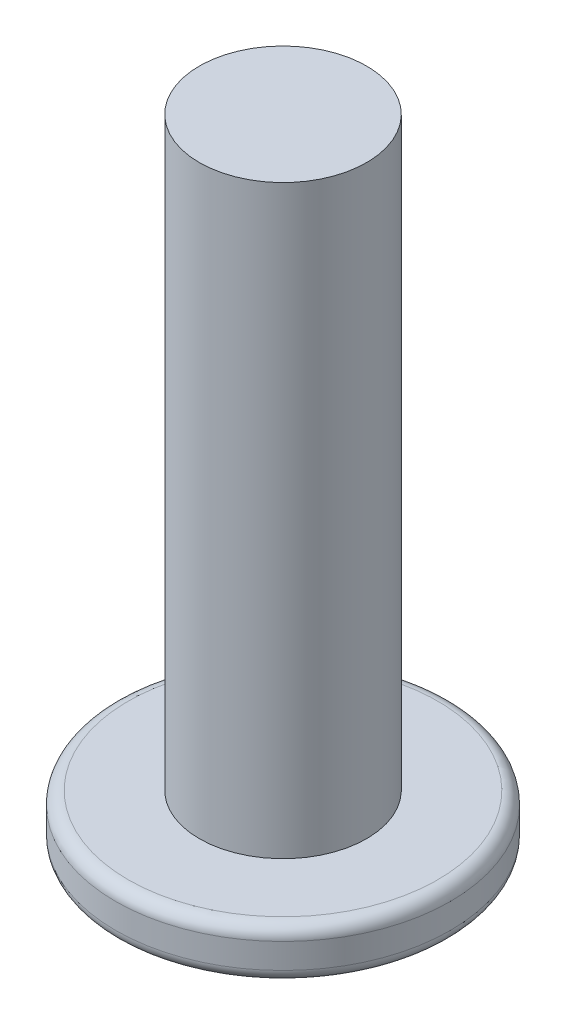
ISO-10303-21;
HEADER;
FILE_DESCRIPTION(('STEP AP214'),'2;1');
FILE_NAME('part.step','',(''),(''),'','','');
FILE_SCHEMA(('AUTOMOTIVE_DESIGN { 1 0 10303 214 1 1 1 1 }'));
ENDSEC;
DATA;
#1=APPLICATION_CONTEXT('core data for automotive mechanical design processes');
#2=APPLICATION_PROTOCOL_DEFINITION('international standard','automotive_design',2000,#1);
#3=PRODUCT_CONTEXT('',#1,'mechanical');
#4=PRODUCT('Part','Part','',(#3));
#5=PRODUCT_RELATED_PRODUCT_CATEGORY('part','',(#4));
#6=PRODUCT_DEFINITION_FORMATION('','',#4);
#7=PRODUCT_DEFINITION_CONTEXT('part definition',#1,'design');
#8=PRODUCT_DEFINITION('design','',#6,#7);
#9=PRODUCT_DEFINITION_SHAPE('','',#8);
#10=(LENGTH_UNIT() NAMED_UNIT(*) SI_UNIT(.MILLI.,.METRE.));
#11=(NAMED_UNIT(*) PLANE_ANGLE_UNIT() SI_UNIT($,.RADIAN.));
#12=(NAMED_UNIT(*) SI_UNIT($,.STERADIAN.) SOLID_ANGLE_UNIT());
#13=UNCERTAINTY_MEASURE_WITH_UNIT(LENGTH_MEASURE(1.E-05),#10,'distance_accuracy_value','');
#14=(GEOMETRIC_REPRESENTATION_CONTEXT(3) GLOBAL_UNCERTAINTY_ASSIGNED_CONTEXT((#13)) GLOBAL_UNIT_ASSIGNED_CONTEXT((#10,
#11,#12)) REPRESENTATION_CONTEXT('',''));
#15=CARTESIAN_POINT('',(0.,0.,0.));
#16=DIRECTION('',(0.,0.,1.));
#17=DIRECTION('',(1.,0.,0.));
#18=AXIS2_PLACEMENT_3D('',#15,#16,#17);
#19=CARTESIAN_POINT('',(0.,1.2,0.));
#20=DIRECTION('',(0.,-1.,0.));
#21=DIRECTION('',(0.,0.,-1.));
#22=AXIS2_PLACEMENT_3D('',#19,#20,#21);
#23=CYLINDRICAL_SURFACE('',#22,4.);
#24=CARTESIAN_POINT('',(0.,0.3,0.));
#25=DIRECTION('',(0.,1.,0.));
#26=DIRECTION('',(0.,0.,1.));
#27=AXIS2_PLACEMENT_3D('',#24,#25,#26);
#28=CIRCLE('',#27,4.);
#29=CARTESIAN_POINT('',(0.,0.3,4.));
#30=VERTEX_POINT('',#29);
#31=EDGE_CURVE('E149',#30,#30,#28,.T.);
#32=ORIENTED_EDGE('',*,*,#31,.T.);
#33=EDGE_LOOP('',(#32));
#34=FACE_BOUND('',#33,.T.);
#35=CARTESIAN_POINT('',(0.,0.9,0.));
#36=DIRECTION('',(0.,1.,0.));
#37=DIRECTION('',(0.,0.,1.));
#38=AXIS2_PLACEMENT_3D('',#35,#36,#37);
#39=CIRCLE('',#38,4.);
#40=CARTESIAN_POINT('',(0.,0.9,4.));
#41=VERTEX_POINT('',#40);
#42=EDGE_CURVE('E146',#41,#41,#39,.F.);
#43=ORIENTED_EDGE('',*,*,#42,.T.);
#44=EDGE_LOOP('',(#43));
#45=FACE_BOUND('',#44,.T.);
#46=ADVANCED_FACE('F33',(#34,#45),#23,.T.);
#47=CARTESIAN_POINT('',(0.,1.2,0.));
#48=DIRECTION('',(0.,1.,0.));
#49=DIRECTION('',(0.,0.,1.));
#50=AXIS2_PLACEMENT_3D('',#47,#48,#49);
#51=PLANE('',#50);
#52=CARTESIAN_POINT('',(0.,1.2,0.));
#53=DIRECTION('',(0.,1.,0.));
#54=DIRECTION('',(0.,0.,1.));
#55=AXIS2_PLACEMENT_3D('',#52,#53,#54);
#56=CIRCLE('',#55,3.7);
#57=CARTESIAN_POINT('',(0.,1.2,3.7));
#58=VERTEX_POINT('',#57);
#59=EDGE_CURVE('E11',#58,#58,#56,.T.);
#60=ORIENTED_EDGE('',*,*,#59,.T.);
#61=EDGE_LOOP('',(#60));
#62=FACE_BOUND('',#61,.T.);
#63=CARTESIAN_POINT('',(0.,1.2,0.));
#64=DIRECTION('',(0.,1.,0.));
#65=DIRECTION('',(0.,0.,1.));
#66=AXIS2_PLACEMENT_3D('',#63,#64,#65);
#67=CIRCLE('',#66,2.);
#68=CARTESIAN_POINT('',(0.,1.2,2.));
#69=VERTEX_POINT('',#68);
#70=EDGE_CURVE('E143',#69,#69,#67,.T.);
#71=ORIENTED_EDGE('',*,*,#70,.F.);
#72=EDGE_LOOP('',(#71));
#73=FACE_BOUND('',#72,.T.);
#74=ADVANCED_FACE('F164',(#62,#73),#51,.T.);
#75=CARTESIAN_POINT('',(0.,0.,0.));
#76=DIRECTION('',(0.,1.,0.));
#77=DIRECTION('',(0.,0.,1.));
#78=AXIS2_PLACEMENT_3D('',#75,#76,#77);
#79=PLANE('',#78);
#80=DIRECTION('',(-0.5,0.,0.866025403784438));
#81=VECTOR('',#80,1.);
#82=CARTESIAN_POINT('',(1.44337567297406,0.,0.));
#83=LINE('',#82,#81);
#84=CARTESIAN_POINT('',(1.44337567297406,0.,0.));
#85=VERTEX_POINT('',#84);
#86=CARTESIAN_POINT('',(0.721687836487032,0.,1.25));
#87=VERTEX_POINT('',#86);
#88=EDGE_CURVE('E122',#85,#87,#83,.T.);
#89=ORIENTED_EDGE('',*,*,#88,.F.);
#90=DIRECTION('',(0.5,0.,0.866025403784439));
#91=VECTOR('',#90,1.);
#92=CARTESIAN_POINT('',(0.721687836487032,0.,-1.25));
#93=LINE('',#92,#91);
#94=CARTESIAN_POINT('',(0.721687836487032,0.,-1.25));
#95=VERTEX_POINT('',#94);
#96=EDGE_CURVE('E48',#95,#85,#93,.T.);
#97=ORIENTED_EDGE('',*,*,#96,.F.);
#98=DIRECTION('',(1.,0.,0.));
#99=VECTOR('',#98,1.);
#100=CARTESIAN_POINT('',(-0.721687836487033,0.,-1.25));
#101=LINE('',#100,#99);
#102=CARTESIAN_POINT('',(-0.721687836487033,0.,-1.25));
#103=VERTEX_POINT('',#102);
#104=EDGE_CURVE('E131',#103,#95,#101,.T.);
#105=ORIENTED_EDGE('',*,*,#104,.F.);
#106=DIRECTION('',(0.5,0.,-0.866025403784439));
#107=VECTOR('',#106,1.);
#108=CARTESIAN_POINT('',(-1.44337567297406,0.,0.));
#109=LINE('',#108,#107);
#110=CARTESIAN_POINT('',(-1.44337567297406,0.,0.));
#111=VERTEX_POINT('',#110);
#112=EDGE_CURVE('E129',#111,#103,#109,.T.);
#113=ORIENTED_EDGE('',*,*,#112,.F.);
#114=DIRECTION('',(-0.5,0.,-0.866025403784439));
#115=VECTOR('',#114,1.);
#116=CARTESIAN_POINT('',(-0.721687836487032,0.,1.25));
#117=LINE('',#116,#115);
#118=CARTESIAN_POINT('',(-0.721687836487032,0.,1.25));
#119=VERTEX_POINT('',#118);
#120=EDGE_CURVE('E96',#119,#111,#117,.T.);
#121=ORIENTED_EDGE('',*,*,#120,.F.);
#122=DIRECTION('',(-1.,0.,0.));
#123=VECTOR('',#122,1.);
#124=CARTESIAN_POINT('',(0.721687836487032,0.,1.25));
#125=LINE('',#124,#123);
#126=EDGE_CURVE('E125',#87,#119,#125,.T.);
#127=ORIENTED_EDGE('',*,*,#126,.F.);
#128=EDGE_LOOP('',(#89,#97,#105,#113,#121,#127));
#129=FACE_BOUND('',#128,.T.);
#130=CARTESIAN_POINT('',(0.,0.,0.));
#131=DIRECTION('',(0.,1.,0.));
#132=DIRECTION('',(0.,0.,1.));
#133=AXIS2_PLACEMENT_3D('',#130,#131,#132);
#134=CIRCLE('',#133,3.7);
#135=CARTESIAN_POINT('',(0.,0.,3.7));
#136=VERTEX_POINT('',#135);
#137=EDGE_CURVE('E41',#136,#136,#134,.F.);
#138=ORIENTED_EDGE('',*,*,#137,.T.);
#139=EDGE_LOOP('',(#138));
#140=FACE_BOUND('',#139,.T.);
#141=ADVANCED_FACE('F154',(#129,#140),#79,.F.);
#142=CARTESIAN_POINT('',(0.,15.2,0.));
#143=DIRECTION('',(0.,-1.,0.));
#144=DIRECTION('',(0.,0.,-1.));
#145=AXIS2_PLACEMENT_3D('',#142,#143,#144);
#146=CYLINDRICAL_SURFACE('',#145,2.);
#147=CARTESIAN_POINT('',(0.,15.2,0.));
#148=DIRECTION('',(0.,1.,0.));
#149=DIRECTION('',(0.,0.,1.));
#150=AXIS2_PLACEMENT_3D('',#147,#148,#149);
#151=CIRCLE('',#150,2.);
#152=CARTESIAN_POINT('',(0.,15.2,2.));
#153=VERTEX_POINT('',#152);
#154=EDGE_CURVE('E135',#153,#153,#151,.T.);
#155=ORIENTED_EDGE('',*,*,#154,.F.);
#156=EDGE_LOOP('',(#155));
#157=FACE_BOUND('',#156,.T.);
#158=ORIENTED_EDGE('',*,*,#70,.T.);
#159=EDGE_LOOP('',(#158));
#160=FACE_BOUND('',#159,.T.);
#161=ADVANCED_FACE('F178',(#157,#160),#146,.T.);
#162=CARTESIAN_POINT('',(0.,15.2,0.));
#163=DIRECTION('',(0.,1.,0.));
#164=DIRECTION('',(0.,0.,1.));
#165=AXIS2_PLACEMENT_3D('',#162,#163,#164);
#166=PLANE('',#165);
#167=ORIENTED_EDGE('',*,*,#154,.T.);
#168=EDGE_LOOP('',(#167));
#169=FACE_BOUND('',#168,.T.);
#170=ADVANCED_FACE('F159',(#169),#166,.T.);
#171=CARTESIAN_POINT('',(0.,0.3,0.));
#172=DIRECTION('',(0.,1.,0.));
#173=DIRECTION('',(0.,0.,1.));
#174=AXIS2_PLACEMENT_3D('',#171,#172,#173);
#175=TOROIDAL_SURFACE('',#174,3.7,0.3);
#176=ORIENTED_EDGE('',*,*,#137,.F.);
#177=EDGE_LOOP('',(#176));
#178=FACE_BOUND('',#177,.T.);
#179=ORIENTED_EDGE('',*,*,#31,.F.);
#180=EDGE_LOOP('',(#179));
#181=FACE_BOUND('',#180,.T.);
#182=ADVANCED_FACE('F156',(#178,#181),#175,.T.);
#183=CARTESIAN_POINT('',(0.,0.9,0.));
#184=DIRECTION('',(0.,1.,0.));
#185=DIRECTION('',(0.,0.,1.));
#186=AXIS2_PLACEMENT_3D('',#183,#184,#185);
#187=TOROIDAL_SURFACE('',#186,3.7,0.3);
#188=ORIENTED_EDGE('',*,*,#42,.F.);
#189=EDGE_LOOP('',(#188));
#190=FACE_BOUND('',#189,.T.);
#191=ORIENTED_EDGE('',*,*,#59,.F.);
#192=EDGE_LOOP('',(#191));
#193=FACE_BOUND('',#192,.T.);
#194=ADVANCED_FACE('F35',(#190,#193),#187,.T.);
#195=CARTESIAN_POINT('',(0.721687836487032,0.6,-1.25));
#196=DIRECTION('',(0.866025403784439,0.,-0.5));
#197=DIRECTION('',(-0.5,0.,-0.866025403784439));
#198=AXIS2_PLACEMENT_3D('',#195,#196,#197);
#199=PLANE('',#198);
#200=ORIENTED_EDGE('',*,*,#96,.T.);
#201=DIRECTION('',(0.,-1.,0.));
#202=VECTOR('',#201,1.);
#203=CARTESIAN_POINT('',(1.44337567297406,0.6,0.));
#204=LINE('',#203,#202);
#205=CARTESIAN_POINT('',(1.44337567297406,0.6,0.));
#206=VERTEX_POINT('',#205);
#207=EDGE_CURVE('E78',#206,#85,#204,.T.);
#208=ORIENTED_EDGE('',*,*,#207,.F.);
#209=DIRECTION('',(0.5,0.,0.866025403784439));
#210=VECTOR('',#209,1.);
#211=CARTESIAN_POINT('',(0.721687836487032,0.6,-1.25));
#212=LINE('',#211,#210);
#213=CARTESIAN_POINT('',(0.721687836487032,0.6,-1.25));
#214=VERTEX_POINT('',#213);
#215=EDGE_CURVE('E133',#214,#206,#212,.T.);
#216=ORIENTED_EDGE('',*,*,#215,.F.);
#217=DIRECTION('',(0.,-1.,0.));
#218=VECTOR('',#217,1.);
#219=CARTESIAN_POINT('',(0.721687836487032,0.6,-1.25));
#220=LINE('',#219,#218);
#221=EDGE_CURVE('E56',#214,#95,#220,.T.);
#222=ORIENTED_EDGE('',*,*,#221,.T.);
#223=EDGE_LOOP('',(#200,#208,#216,#222));
#224=FACE_BOUND('',#223,.T.);
#225=ADVANCED_FACE('F170',(#224),#199,.F.);
#226=CARTESIAN_POINT('',(-0.721687836487033,0.6,-1.25));
#227=DIRECTION('',(0.,0.,-1.));
#228=DIRECTION('',(-1.,0.,0.));
#229=AXIS2_PLACEMENT_3D('',#226,#227,#228);
#230=PLANE('',#229);
#231=ORIENTED_EDGE('',*,*,#104,.T.);
#232=ORIENTED_EDGE('',*,*,#221,.F.);
#233=DIRECTION('',(1.,0.,0.));
#234=VECTOR('',#233,1.);
#235=CARTESIAN_POINT('',(-0.721687836487033,0.6,-1.25));
#236=LINE('',#235,#234);
#237=CARTESIAN_POINT('',(-0.721687836487033,0.6,-1.25));
#238=VERTEX_POINT('',#237);
#239=EDGE_CURVE('E108',#238,#214,#236,.T.);
#240=ORIENTED_EDGE('',*,*,#239,.F.);
#241=DIRECTION('',(0.,-1.,0.));
#242=VECTOR('',#241,1.);
#243=CARTESIAN_POINT('',(-0.721687836487033,0.6,-1.25));
#244=LINE('',#243,#242);
#245=EDGE_CURVE('E100',#238,#103,#244,.T.);
#246=ORIENTED_EDGE('',*,*,#245,.T.);
#247=EDGE_LOOP('',(#231,#232,#240,#246));
#248=FACE_BOUND('',#247,.T.);
#249=ADVANCED_FACE('F194',(#248),#230,.F.);
#250=CARTESIAN_POINT('',(-1.44337567297406,0.6,0.));
#251=DIRECTION('',(-0.866025403784439,0.,-0.5));
#252=DIRECTION('',(-0.5,0.,0.866025403784439));
#253=AXIS2_PLACEMENT_3D('',#250,#251,#252);
#254=PLANE('',#253);
#255=ORIENTED_EDGE('',*,*,#112,.T.);
#256=ORIENTED_EDGE('',*,*,#245,.F.);
#257=DIRECTION('',(0.5,0.,-0.866025403784439));
#258=VECTOR('',#257,1.);
#259=CARTESIAN_POINT('',(-1.44337567297406,0.6,0.));
#260=LINE('',#259,#258);
#261=CARTESIAN_POINT('',(-1.44337567297406,0.6,0.));
#262=VERTEX_POINT('',#261);
#263=EDGE_CURVE('E104',#262,#238,#260,.T.);
#264=ORIENTED_EDGE('',*,*,#263,.F.);
#265=DIRECTION('',(0.,-1.,0.));
#266=VECTOR('',#265,1.);
#267=CARTESIAN_POINT('',(-1.44337567297406,0.6,0.));
#268=LINE('',#267,#266);
#269=EDGE_CURVE('E89',#262,#111,#268,.T.);
#270=ORIENTED_EDGE('',*,*,#269,.T.);
#271=EDGE_LOOP('',(#255,#256,#264,#270));
#272=FACE_BOUND('',#271,.T.);
#273=ADVANCED_FACE('F105',(#272),#254,.F.);
#274=CARTESIAN_POINT('',(-0.721687836487032,0.6,1.25));
#275=DIRECTION('',(-0.866025403784439,0.,0.5));
#276=DIRECTION('',(0.5,0.,0.866025403784439));
#277=AXIS2_PLACEMENT_3D('',#274,#275,#276);
#278=PLANE('',#277);
#279=ORIENTED_EDGE('',*,*,#120,.T.);
#280=ORIENTED_EDGE('',*,*,#269,.F.);
#281=DIRECTION('',(-0.5,0.,-0.866025403784439));
#282=VECTOR('',#281,1.);
#283=CARTESIAN_POINT('',(-0.721687836487032,0.6,1.25));
#284=LINE('',#283,#282);
#285=CARTESIAN_POINT('',(-0.721687836487032,0.6,1.25));
#286=VERTEX_POINT('',#285);
#287=EDGE_CURVE('E93',#286,#262,#284,.T.);
#288=ORIENTED_EDGE('',*,*,#287,.F.);
#289=DIRECTION('',(0.,-1.,0.));
#290=VECTOR('',#289,1.);
#291=CARTESIAN_POINT('',(-0.721687836487032,0.6,1.25));
#292=LINE('',#291,#290);
#293=EDGE_CURVE('E101',#286,#119,#292,.T.);
#294=ORIENTED_EDGE('',*,*,#293,.T.);
#295=EDGE_LOOP('',(#279,#280,#288,#294));
#296=FACE_BOUND('',#295,.T.);
#297=ADVANCED_FACE('F91',(#296),#278,.F.);
#298=CARTESIAN_POINT('',(0.721687836487032,0.6,1.25));
#299=DIRECTION('',(0.,0.,1.));
#300=DIRECTION('',(1.,0.,0.));
#301=AXIS2_PLACEMENT_3D('',#298,#299,#300);
#302=PLANE('',#301);
#303=ORIENTED_EDGE('',*,*,#126,.T.);
#304=ORIENTED_EDGE('',*,*,#293,.F.);
#305=DIRECTION('',(-1.,0.,0.));
#306=VECTOR('',#305,1.);
#307=CARTESIAN_POINT('',(0.721687836487032,0.6,1.25));
#308=LINE('',#307,#306);
#309=CARTESIAN_POINT('',(0.721687836487032,0.6,1.25));
#310=VERTEX_POINT('',#309);
#311=EDGE_CURVE('E114',#310,#286,#308,.T.);
#312=ORIENTED_EDGE('',*,*,#311,.F.);
#313=DIRECTION('',(0.,-1.,0.));
#314=VECTOR('',#313,1.);
#315=CARTESIAN_POINT('',(0.721687836487032,0.6,1.25));
#316=LINE('',#315,#314);
#317=EDGE_CURVE('E138',#310,#87,#316,.T.);
#318=ORIENTED_EDGE('',*,*,#317,.T.);
#319=EDGE_LOOP('',(#303,#304,#312,#318));
#320=FACE_BOUND('',#319,.T.);
#321=ADVANCED_FACE('F198',(#320),#302,.F.);
#322=CARTESIAN_POINT('',(1.44337567297406,0.6,0.));
#323=DIRECTION('',(0.866025403784438,0.,0.5));
#324=DIRECTION('',(0.5,0.,-0.866025403784439));
#325=AXIS2_PLACEMENT_3D('',#322,#323,#324);
#326=PLANE('',#325);
#327=ORIENTED_EDGE('',*,*,#88,.T.);
#328=ORIENTED_EDGE('',*,*,#317,.F.);
#329=DIRECTION('',(-0.5,0.,0.866025403784438));
#330=VECTOR('',#329,1.);
#331=CARTESIAN_POINT('',(1.44337567297406,0.6,0.));
#332=LINE('',#331,#330);
#333=EDGE_CURVE('E116',#206,#310,#332,.T.);
#334=ORIENTED_EDGE('',*,*,#333,.F.);
#335=ORIENTED_EDGE('',*,*,#207,.T.);
#336=EDGE_LOOP('',(#327,#328,#334,#335));
#337=FACE_BOUND('',#336,.T.);
#338=ADVANCED_FACE('F195',(#337),#326,.F.);
#339=CARTESIAN_POINT('',(0.,0.6,0.));
#340=DIRECTION('',(0.,-1.,0.));
#341=DIRECTION('',(0.,0.,-1.));
#342=AXIS2_PLACEMENT_3D('',#339,#340,#341);
#343=PLANE('',#342);
#344=ORIENTED_EDGE('',*,*,#215,.T.);
#345=ORIENTED_EDGE('',*,*,#333,.T.);
#346=ORIENTED_EDGE('',*,*,#311,.T.);
#347=ORIENTED_EDGE('',*,*,#287,.T.);
#348=ORIENTED_EDGE('',*,*,#263,.T.);
#349=ORIENTED_EDGE('',*,*,#239,.T.);
#350=EDGE_LOOP('',(#344,#345,#346,#347,#348,#349));
#351=FACE_BOUND('',#350,.T.);
#352=ADVANCED_FACE('F111',(#351),#343,.T.);
#353=CLOSED_SHELL('',(#46,#74,#141,#161,#170,#182,#194,#225,#249,#273,#297,#321,#338,#352));
#354=MANIFOLD_SOLID_BREP('B2',#353);
#355=ADVANCED_BREP_SHAPE_REPRESENTATION('',(#18,#354),#14);
#356=SHAPE_DEFINITION_REPRESENTATION(#9,#355);
ENDSEC;
END-ISO-10303-21;
